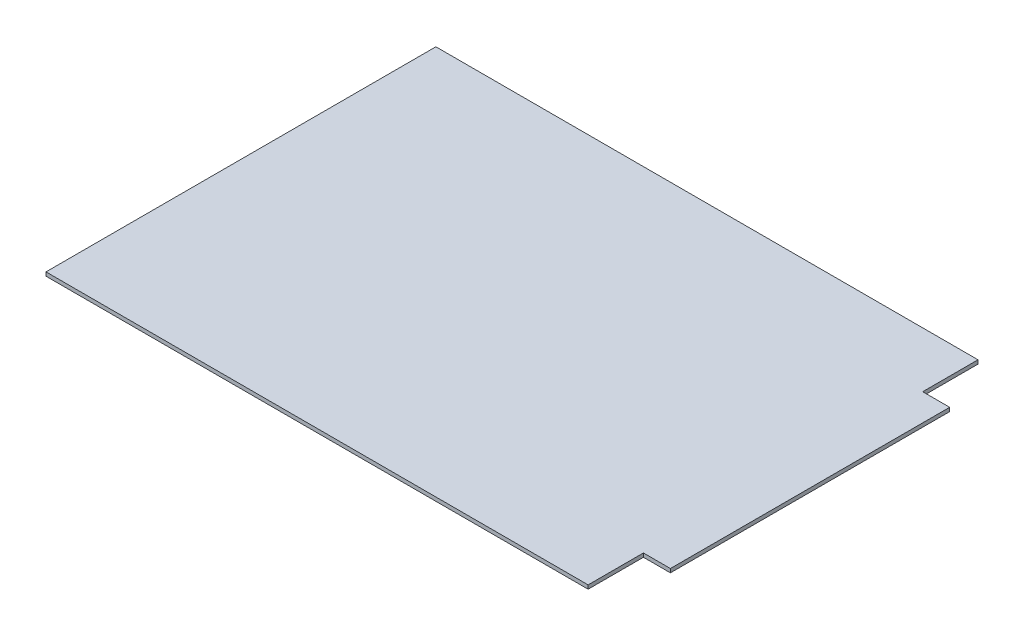
ISO-10303-21;
HEADER;
FILE_DESCRIPTION(('STEP AP214'),'2;1');
FILE_NAME('part.step','',(''),(''),'','','');
FILE_SCHEMA(('AUTOMOTIVE_DESIGN { 1 0 10303 214 1 1 1 1 }'));
ENDSEC;
DATA;
#1=APPLICATION_CONTEXT('core data for automotive mechanical design processes');
#2=APPLICATION_PROTOCOL_DEFINITION('international standard','automotive_design',2000,#1);
#3=PRODUCT_CONTEXT('',#1,'mechanical');
#4=PRODUCT('Part','Part','',(#3));
#5=PRODUCT_RELATED_PRODUCT_CATEGORY('part','',(#4));
#6=PRODUCT_DEFINITION_FORMATION('','',#4);
#7=PRODUCT_DEFINITION_CONTEXT('part definition',#1,'design');
#8=PRODUCT_DEFINITION('design','',#6,#7);
#9=PRODUCT_DEFINITION_SHAPE('','',#8);
#10=(LENGTH_UNIT() NAMED_UNIT(*) SI_UNIT(.MILLI.,.METRE.));
#11=(NAMED_UNIT(*) PLANE_ANGLE_UNIT() SI_UNIT($,.RADIAN.));
#12=(NAMED_UNIT(*) SI_UNIT($,.STERADIAN.) SOLID_ANGLE_UNIT());
#13=UNCERTAINTY_MEASURE_WITH_UNIT(LENGTH_MEASURE(1.E-05),#10,'distance_accuracy_value','');
#14=(GEOMETRIC_REPRESENTATION_CONTEXT(3) GLOBAL_UNCERTAINTY_ASSIGNED_CONTEXT((#13)) GLOBAL_UNIT_ASSIGNED_CONTEXT((#10,
#11,#12)) REPRESENTATION_CONTEXT('',''));
#15=CARTESIAN_POINT('',(0.,0.,0.));
#16=DIRECTION('',(0.,0.,1.));
#17=DIRECTION('',(1.,0.,0.));
#18=AXIS2_PLACEMENT_3D('',#15,#16,#17);
#19=CARTESIAN_POINT('',(210.93,2.8,-144.5));
#20=DIRECTION('',(-1.,0.,0.));
#21=DIRECTION('',(0.,0.,1.));
#22=AXIS2_PLACEMENT_3D('',#19,#20,#21);
#23=PLANE('',#22);
#24=DIRECTION('',(0.,1.,0.));
#25=VECTOR('',#24,1.);
#26=CARTESIAN_POINT('',(210.93,0.,-103.5));
#27=LINE('',#26,#25);
#28=CARTESIAN_POINT('',(210.93,0.,-103.5));
#29=VERTEX_POINT('',#28);
#30=CARTESIAN_POINT('',(210.93,2.8,-103.5));
#31=VERTEX_POINT('',#30);
#32=EDGE_CURVE('E107',#29,#31,#27,.T.);
#33=ORIENTED_EDGE('',*,*,#32,.T.);
#34=DIRECTION('',(0.,0.,-1.));
#35=VECTOR('',#34,1.);
#36=CARTESIAN_POINT('',(210.93,2.8,-144.5));
#37=LINE('',#36,#35);
#38=CARTESIAN_POINT('',(210.93,2.8,103.5));
#39=VERTEX_POINT('',#38);
#40=EDGE_CURVE('E130',#39,#31,#37,.T.);
#41=ORIENTED_EDGE('',*,*,#40,.F.);
#42=DIRECTION('',(0.,1.,0.));
#43=VECTOR('',#42,1.);
#44=CARTESIAN_POINT('',(210.93,0.,103.5));
#45=LINE('',#44,#43);
#46=CARTESIAN_POINT('',(210.93,0.,103.5));
#47=VERTEX_POINT('',#46);
#48=EDGE_CURVE('E157',#47,#39,#45,.T.);
#49=ORIENTED_EDGE('',*,*,#48,.F.);
#50=DIRECTION('',(0.,0.,-1.));
#51=VECTOR('',#50,1.);
#52=CARTESIAN_POINT('',(210.93,0.,-144.5));
#53=LINE('',#52,#51);
#54=EDGE_CURVE('E121',#47,#29,#53,.T.);
#55=ORIENTED_EDGE('',*,*,#54,.T.);
#56=EDGE_LOOP('',(#33,#41,#49,#55));
#57=FACE_BOUND('',#56,.T.);
#58=ADVANCED_FACE('F37',(#57),#23,.F.);
#59=CARTESIAN_POINT('',(-210.93,2.8,144.5));
#60=DIRECTION('',(0.,0.,-1.));
#61=DIRECTION('',(-1.,0.,0.));
#62=AXIS2_PLACEMENT_3D('',#59,#60,#61);
#63=PLANE('',#62);
#64=DIRECTION('',(0.,1.,0.));
#65=VECTOR('',#64,1.);
#66=CARTESIAN_POINT('',(190.93,0.,144.5));
#67=LINE('',#66,#65);
#68=CARTESIAN_POINT('',(190.93,0.,144.5));
#69=VERTEX_POINT('',#68);
#70=CARTESIAN_POINT('',(190.93,2.8,144.5));
#71=VERTEX_POINT('',#70);
#72=EDGE_CURVE('E59',#69,#71,#67,.T.);
#73=ORIENTED_EDGE('',*,*,#72,.T.);
#74=DIRECTION('',(1.,0.,0.));
#75=VECTOR('',#74,1.);
#76=CARTESIAN_POINT('',(-210.93,2.8,144.5));
#77=LINE('',#76,#75);
#78=CARTESIAN_POINT('',(-210.93,2.8,144.5));
#79=VERTEX_POINT('',#78);
#80=EDGE_CURVE('E132',#79,#71,#77,.T.);
#81=ORIENTED_EDGE('',*,*,#80,.F.);
#82=DIRECTION('',(0.,-1.,0.));
#83=VECTOR('',#82,1.);
#84=CARTESIAN_POINT('',(-210.93,2.8,144.5));
#85=LINE('',#84,#83);
#86=CARTESIAN_POINT('',(-210.93,0.,144.5));
#87=VERTEX_POINT('',#86);
#88=EDGE_CURVE('E44',#79,#87,#85,.T.);
#89=ORIENTED_EDGE('',*,*,#88,.T.);
#90=DIRECTION('',(1.,0.,0.));
#91=VECTOR('',#90,1.);
#92=CARTESIAN_POINT('',(-210.93,0.,144.5));
#93=LINE('',#92,#91);
#94=EDGE_CURVE('E123',#87,#69,#93,.T.);
#95=ORIENTED_EDGE('',*,*,#94,.T.);
#96=EDGE_LOOP('',(#73,#81,#89,#95));
#97=FACE_BOUND('',#96,.T.);
#98=ADVANCED_FACE('F180',(#97),#63,.F.);
#99=CARTESIAN_POINT('',(0.,2.8,0.));
#100=DIRECTION('',(0.,1.,0.));
#101=DIRECTION('',(0.,0.,1.));
#102=AXIS2_PLACEMENT_3D('',#99,#100,#101);
#103=PLANE('',#102);
#104=ORIENTED_EDGE('',*,*,#40,.T.);
#105=DIRECTION('',(-1.,0.,0.));
#106=VECTOR('',#105,1.);
#107=CARTESIAN_POINT('',(210.93,2.8,-103.5));
#108=LINE('',#107,#106);
#109=CARTESIAN_POINT('',(190.93,2.8,-103.5));
#110=VERTEX_POINT('',#109);
#111=EDGE_CURVE('E155',#31,#110,#108,.T.);
#112=ORIENTED_EDGE('',*,*,#111,.T.);
#113=DIRECTION('',(0.,0.,1.));
#114=VECTOR('',#113,1.);
#115=CARTESIAN_POINT('',(190.93,2.8,-144.5));
#116=LINE('',#115,#114);
#117=CARTESIAN_POINT('',(190.93,2.8,-144.5));
#118=VERTEX_POINT('',#117);
#119=EDGE_CURVE('E164',#118,#110,#116,.T.);
#120=ORIENTED_EDGE('',*,*,#119,.F.);
#121=DIRECTION('',(-1.,0.,0.));
#122=VECTOR('',#121,1.);
#123=CARTESIAN_POINT('',(-210.93,2.8,-144.5));
#124=LINE('',#123,#122);
#125=CARTESIAN_POINT('',(-210.93,2.8,-144.5));
#126=VERTEX_POINT('',#125);
#127=EDGE_CURVE('E115',#118,#126,#124,.T.);
#128=ORIENTED_EDGE('',*,*,#127,.T.);
#129=DIRECTION('',(0.,0.,1.));
#130=VECTOR('',#129,1.);
#131=CARTESIAN_POINT('',(-210.93,2.8,-144.5));
#132=LINE('',#131,#130);
#133=EDGE_CURVE('E137',#126,#79,#132,.T.);
#134=ORIENTED_EDGE('',*,*,#133,.T.);
#135=ORIENTED_EDGE('',*,*,#80,.T.);
#136=DIRECTION('',(0.,0.,-1.));
#137=VECTOR('',#136,1.);
#138=CARTESIAN_POINT('',(190.93,2.8,144.5));
#139=LINE('',#138,#137);
#140=CARTESIAN_POINT('',(190.93,2.8,103.5));
#141=VERTEX_POINT('',#140);
#142=EDGE_CURVE('E148',#71,#141,#139,.T.);
#143=ORIENTED_EDGE('',*,*,#142,.T.);
#144=DIRECTION('',(-1.,0.,0.));
#145=VECTOR('',#144,1.);
#146=CARTESIAN_POINT('',(210.93,2.8,103.5));
#147=LINE('',#146,#145);
#148=EDGE_CURVE('E152',#39,#141,#147,.T.);
#149=ORIENTED_EDGE('',*,*,#148,.F.);
#150=EDGE_LOOP('',(#104,#112,#120,#128,#134,#135,#143,#149));
#151=FACE_BOUND('',#150,.T.);
#152=ADVANCED_FACE('F178',(#151),#103,.T.);
#153=CARTESIAN_POINT('',(0.,0.,0.));
#154=DIRECTION('',(0.,1.,0.));
#155=DIRECTION('',(0.,0.,1.));
#156=AXIS2_PLACEMENT_3D('',#153,#154,#155);
#157=PLANE('',#156);
#158=DIRECTION('',(-1.,0.,0.));
#159=VECTOR('',#158,1.);
#160=CARTESIAN_POINT('',(210.93,0.,-103.5));
#161=LINE('',#160,#159);
#162=CARTESIAN_POINT('',(190.93,0.,-103.5));
#163=VERTEX_POINT('',#162);
#164=EDGE_CURVE('E108',#29,#163,#161,.T.);
#165=ORIENTED_EDGE('',*,*,#164,.F.);
#166=ORIENTED_EDGE('',*,*,#54,.F.);
#167=DIRECTION('',(-1.,0.,0.));
#168=VECTOR('',#167,1.);
#169=CARTESIAN_POINT('',(210.93,0.,103.5));
#170=LINE('',#169,#168);
#171=CARTESIAN_POINT('',(190.93,0.,103.5));
#172=VERTEX_POINT('',#171);
#173=EDGE_CURVE('E145',#47,#172,#170,.T.);
#174=ORIENTED_EDGE('',*,*,#173,.T.);
#175=DIRECTION('',(0.,0.,-1.));
#176=VECTOR('',#175,1.);
#177=CARTESIAN_POINT('',(190.93,0.,144.5));
#178=LINE('',#177,#176);
#179=EDGE_CURVE('E149',#69,#172,#178,.T.);
#180=ORIENTED_EDGE('',*,*,#179,.F.);
#181=ORIENTED_EDGE('',*,*,#94,.F.);
#182=DIRECTION('',(0.,0.,1.));
#183=VECTOR('',#182,1.);
#184=CARTESIAN_POINT('',(-210.93,0.,-144.5));
#185=LINE('',#184,#183);
#186=CARTESIAN_POINT('',(-210.93,0.,-144.5));
#187=VERTEX_POINT('',#186);
#188=EDGE_CURVE('E120',#187,#87,#185,.T.);
#189=ORIENTED_EDGE('',*,*,#188,.F.);
#190=DIRECTION('',(-1.,0.,0.));
#191=VECTOR('',#190,1.);
#192=CARTESIAN_POINT('',(-210.93,0.,-144.5));
#193=LINE('',#192,#191);
#194=CARTESIAN_POINT('',(190.93,0.,-144.5));
#195=VERTEX_POINT('',#194);
#196=EDGE_CURVE('E114',#195,#187,#193,.T.);
#197=ORIENTED_EDGE('',*,*,#196,.F.);
#198=DIRECTION('',(0.,0.,1.));
#199=VECTOR('',#198,1.);
#200=CARTESIAN_POINT('',(190.93,0.,-144.5));
#201=LINE('',#200,#199);
#202=EDGE_CURVE('E99',#195,#163,#201,.T.);
#203=ORIENTED_EDGE('',*,*,#202,.T.);
#204=EDGE_LOOP('',(#165,#166,#174,#180,#181,#189,#197,#203));
#205=FACE_BOUND('',#204,.T.);
#206=ADVANCED_FACE('F118',(#205),#157,.F.);
#207=CARTESIAN_POINT('',(-210.93,2.8,-144.5));
#208=DIRECTION('',(0.,0.,1.));
#209=DIRECTION('',(1.,0.,0.));
#210=AXIS2_PLACEMENT_3D('',#207,#208,#209);
#211=PLANE('',#210);
#212=ORIENTED_EDGE('',*,*,#127,.F.);
#213=DIRECTION('',(0.,1.,0.));
#214=VECTOR('',#213,1.);
#215=CARTESIAN_POINT('',(190.93,0.,-144.5));
#216=LINE('',#215,#214);
#217=EDGE_CURVE('E102',#195,#118,#216,.T.);
#218=ORIENTED_EDGE('',*,*,#217,.F.);
#219=ORIENTED_EDGE('',*,*,#196,.T.);
#220=DIRECTION('',(0.,-1.,0.));
#221=VECTOR('',#220,1.);
#222=CARTESIAN_POINT('',(-210.93,2.8,-144.5));
#223=LINE('',#222,#221);
#224=EDGE_CURVE('E11',#126,#187,#223,.T.);
#225=ORIENTED_EDGE('',*,*,#224,.F.);
#226=EDGE_LOOP('',(#212,#218,#219,#225));
#227=FACE_BOUND('',#226,.T.);
#228=ADVANCED_FACE('F112',(#227),#211,.F.);
#229=CARTESIAN_POINT('',(-210.93,2.8,-144.5));
#230=DIRECTION('',(1.,0.,0.));
#231=DIRECTION('',(0.,0.,-1.));
#232=AXIS2_PLACEMENT_3D('',#229,#230,#231);
#233=PLANE('',#232);
#234=ORIENTED_EDGE('',*,*,#188,.T.);
#235=ORIENTED_EDGE('',*,*,#88,.F.);
#236=ORIENTED_EDGE('',*,*,#133,.F.);
#237=ORIENTED_EDGE('',*,*,#224,.T.);
#238=EDGE_LOOP('',(#234,#235,#236,#237));
#239=FACE_BOUND('',#238,.T.);
#240=ADVANCED_FACE('F190',(#239),#233,.F.);
#241=CARTESIAN_POINT('',(210.93,0.,103.5));
#242=DIRECTION('',(0.,0.,-1.));
#243=DIRECTION('',(-1.,0.,0.));
#244=AXIS2_PLACEMENT_3D('',#241,#242,#243);
#245=PLANE('',#244);
#246=ORIENTED_EDGE('',*,*,#148,.T.);
#247=DIRECTION('',(0.,1.,0.));
#248=VECTOR('',#247,1.);
#249=CARTESIAN_POINT('',(190.93,0.,103.5));
#250=LINE('',#249,#248);
#251=EDGE_CURVE('E151',#172,#141,#250,.T.);
#252=ORIENTED_EDGE('',*,*,#251,.F.);
#253=ORIENTED_EDGE('',*,*,#173,.F.);
#254=ORIENTED_EDGE('',*,*,#48,.T.);
#255=EDGE_LOOP('',(#246,#252,#253,#254));
#256=FACE_BOUND('',#255,.T.);
#257=ADVANCED_FACE('F176',(#256),#245,.F.);
#258=CARTESIAN_POINT('',(190.93,0.,144.5));
#259=DIRECTION('',(1.,0.,0.));
#260=DIRECTION('',(0.,0.,-1.));
#261=AXIS2_PLACEMENT_3D('',#258,#259,#260);
#262=PLANE('',#261);
#263=ORIENTED_EDGE('',*,*,#142,.F.);
#264=ORIENTED_EDGE('',*,*,#72,.F.);
#265=ORIENTED_EDGE('',*,*,#179,.T.);
#266=ORIENTED_EDGE('',*,*,#251,.T.);
#267=EDGE_LOOP('',(#263,#264,#265,#266));
#268=FACE_BOUND('',#267,.T.);
#269=ADVANCED_FACE('F179',(#268),#262,.T.);
#270=CARTESIAN_POINT('',(210.93,0.,-103.5));
#271=DIRECTION('',(0.,0.,-1.));
#272=DIRECTION('',(-1.,0.,0.));
#273=AXIS2_PLACEMENT_3D('',#270,#271,#272);
#274=PLANE('',#273);
#275=ORIENTED_EDGE('',*,*,#111,.F.);
#276=ORIENTED_EDGE('',*,*,#32,.F.);
#277=ORIENTED_EDGE('',*,*,#164,.T.);
#278=DIRECTION('',(0.,1.,0.));
#279=VECTOR('',#278,1.);
#280=CARTESIAN_POINT('',(190.93,0.,-103.5));
#281=LINE('',#280,#279);
#282=EDGE_CURVE('E51',#163,#110,#281,.T.);
#283=ORIENTED_EDGE('',*,*,#282,.T.);
#284=EDGE_LOOP('',(#275,#276,#277,#283));
#285=FACE_BOUND('',#284,.T.);
#286=ADVANCED_FACE('F169',(#285),#274,.T.);
#287=CARTESIAN_POINT('',(190.93,0.,-144.5));
#288=DIRECTION('',(-1.,0.,0.));
#289=DIRECTION('',(0.,0.,1.));
#290=AXIS2_PLACEMENT_3D('',#287,#288,#289);
#291=PLANE('',#290);
#292=ORIENTED_EDGE('',*,*,#119,.T.);
#293=ORIENTED_EDGE('',*,*,#282,.F.);
#294=ORIENTED_EDGE('',*,*,#202,.F.);
#295=ORIENTED_EDGE('',*,*,#217,.T.);
#296=EDGE_LOOP('',(#292,#293,#294,#295));
#297=FACE_BOUND('',#296,.T.);
#298=ADVANCED_FACE('F101',(#297),#291,.F.);
#299=CLOSED_SHELL('',(#58,#98,#152,#206,#228,#240,#257,#269,#286,#298));
#300=MANIFOLD_SOLID_BREP('B2',#299);
#301=ADVANCED_BREP_SHAPE_REPRESENTATION('',(#18,#300),#14);
#302=SHAPE_DEFINITION_REPRESENTATION(#9,#301);
ENDSEC;
END-ISO-10303-21;
